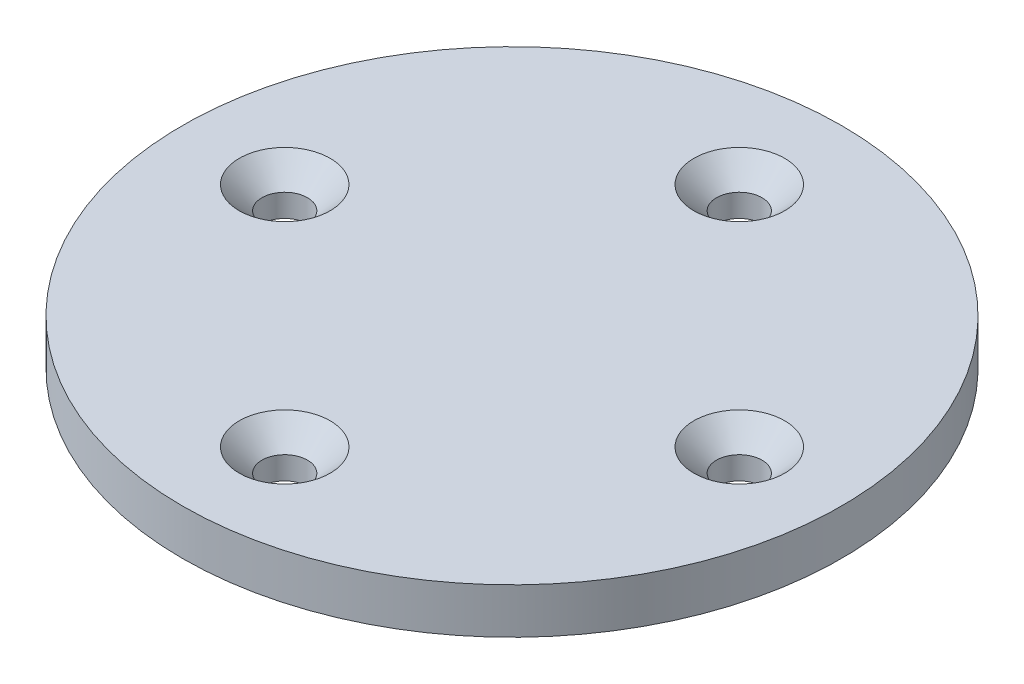
ISO-10303-21;
HEADER;
FILE_DESCRIPTION(('STEP AP214'),'2;1');
FILE_NAME('part.step','',(''),(''),'','','');
FILE_SCHEMA(('AUTOMOTIVE_DESIGN { 1 0 10303 214 1 1 1 1 }'));
ENDSEC;
DATA;
#1=APPLICATION_CONTEXT('core data for automotive mechanical design processes');
#2=APPLICATION_PROTOCOL_DEFINITION('international standard','automotive_design',2000,#1);
#3=PRODUCT_CONTEXT('',#1,'mechanical');
#4=PRODUCT('Part','Part','',(#3));
#5=PRODUCT_RELATED_PRODUCT_CATEGORY('part','',(#4));
#6=PRODUCT_DEFINITION_FORMATION('','',#4);
#7=PRODUCT_DEFINITION_CONTEXT('part definition',#1,'design');
#8=PRODUCT_DEFINITION('design','',#6,#7);
#9=PRODUCT_DEFINITION_SHAPE('','',#8);
#10=(LENGTH_UNIT() NAMED_UNIT(*) SI_UNIT(.MILLI.,.METRE.));
#11=(NAMED_UNIT(*) PLANE_ANGLE_UNIT() SI_UNIT($,.RADIAN.));
#12=(NAMED_UNIT(*) SI_UNIT($,.STERADIAN.) SOLID_ANGLE_UNIT());
#13=UNCERTAINTY_MEASURE_WITH_UNIT(LENGTH_MEASURE(1.E-05),#10,'distance_accuracy_value','');
#14=(GEOMETRIC_REPRESENTATION_CONTEXT(3) GLOBAL_UNCERTAINTY_ASSIGNED_CONTEXT((#13)) GLOBAL_UNIT_ASSIGNED_CONTEXT((#10,
#11,#12)) REPRESENTATION_CONTEXT('',''));
#15=CARTESIAN_POINT('',(0.,0.,0.));
#16=DIRECTION('',(0.,0.,1.));
#17=DIRECTION('',(1.,0.,0.));
#18=AXIS2_PLACEMENT_3D('',#15,#16,#17);
#19=CARTESIAN_POINT('',(0.,2.,0.));
#20=DIRECTION('',(0.,-1.,0.));
#21=DIRECTION('',(0.,0.,-1.));
#22=AXIS2_PLACEMENT_3D('',#19,#20,#21);
#23=CYLINDRICAL_SURFACE('',#22,14.5);
#24=CARTESIAN_POINT('',(0.,2.,0.));
#25=DIRECTION('',(0.,1.,0.));
#26=DIRECTION('',(0.,0.,1.));
#27=AXIS2_PLACEMENT_3D('',#24,#25,#26);
#28=CIRCLE('',#27,14.5);
#29=CARTESIAN_POINT('',(0.,2.,14.5));
#30=VERTEX_POINT('',#29);
#31=EDGE_CURVE('E86',#30,#30,#28,.T.);
#32=ORIENTED_EDGE('',*,*,#31,.F.);
#33=EDGE_LOOP('',(#32));
#34=FACE_BOUND('',#33,.T.);
#35=CARTESIAN_POINT('',(0.,0.,0.));
#36=DIRECTION('',(0.,1.,0.));
#37=DIRECTION('',(0.,0.,1.));
#38=AXIS2_PLACEMENT_3D('',#35,#36,#37);
#39=CIRCLE('',#38,14.5);
#40=CARTESIAN_POINT('',(0.,0.,14.5));
#41=VERTEX_POINT('',#40);
#42=EDGE_CURVE('E97',#41,#41,#39,.T.);
#43=ORIENTED_EDGE('',*,*,#42,.T.);
#44=EDGE_LOOP('',(#43));
#45=FACE_BOUND('',#44,.T.);
#46=ADVANCED_FACE('F45',(#34,#45),#23,.T.);
#47=CARTESIAN_POINT('',(0.,2.,0.));
#48=DIRECTION('',(0.,1.,0.));
#49=DIRECTION('',(0.,0.,1.));
#50=AXIS2_PLACEMENT_3D('',#47,#48,#49);
#51=PLANE('',#50);
#52=CARTESIAN_POINT('',(10.,2.,0.));
#53=DIRECTION('',(0.,1.,0.));
#54=DIRECTION('',(0.,0.,1.));
#55=AXIS2_PLACEMENT_3D('',#52,#53,#54);
#56=CIRCLE('',#55,2.00000000000001);
#57=CARTESIAN_POINT('',(10.,2.,2.00000000000004));
#58=VERTEX_POINT('',#57);
#59=EDGE_CURVE('E64',#58,#58,#56,.F.);
#60=ORIENTED_EDGE('',*,*,#59,.T.);
#61=EDGE_LOOP('',(#60));
#62=FACE_BOUND('',#61,.T.);
#63=CARTESIAN_POINT('',(0.,2.,10.));
#64=DIRECTION('',(0.,1.,0.));
#65=DIRECTION('',(0.,0.,1.));
#66=AXIS2_PLACEMENT_3D('',#63,#64,#65);
#67=CIRCLE('',#66,2.00000000000001);
#68=CARTESIAN_POINT('',(0.,2.,12.));
#69=VERTEX_POINT('',#68);
#70=EDGE_CURVE('E70',#69,#69,#67,.F.);
#71=ORIENTED_EDGE('',*,*,#70,.T.);
#72=EDGE_LOOP('',(#71));
#73=FACE_BOUND('',#72,.T.);
#74=CARTESIAN_POINT('',(0.,2.,-10.));
#75=DIRECTION('',(0.,1.,0.));
#76=DIRECTION('',(0.,0.,1.));
#77=AXIS2_PLACEMENT_3D('',#74,#75,#76);
#78=CIRCLE('',#77,2.);
#79=CARTESIAN_POINT('',(0.,2.,-8.));
#80=VERTEX_POINT('',#79);
#81=EDGE_CURVE('E74',#80,#80,#78,.F.);
#82=ORIENTED_EDGE('',*,*,#81,.T.);
#83=EDGE_LOOP('',(#82));
#84=FACE_BOUND('',#83,.T.);
#85=CARTESIAN_POINT('',(-10.,2.,-1.04744440165294E-13));
#86=DIRECTION('',(0.,1.,0.));
#87=DIRECTION('',(0.,0.,1.));
#88=AXIS2_PLACEMENT_3D('',#85,#86,#87);
#89=CIRCLE('',#88,2.00000000000001);
#90=CARTESIAN_POINT('',(-10.,2.,1.9999999999999));
#91=VERTEX_POINT('',#90);
#92=EDGE_CURVE('E78',#91,#91,#89,.F.);
#93=ORIENTED_EDGE('',*,*,#92,.T.);
#94=EDGE_LOOP('',(#93));
#95=FACE_BOUND('',#94,.T.);
#96=ORIENTED_EDGE('',*,*,#31,.T.);
#97=EDGE_LOOP('',(#96));
#98=FACE_BOUND('',#97,.T.);
#99=ADVANCED_FACE('F130',(#62,#73,#84,#95,#98),#51,.T.);
#100=CARTESIAN_POINT('',(0.,0.,0.));
#101=DIRECTION('',(0.,1.,0.));
#102=DIRECTION('',(0.,0.,1.));
#103=AXIS2_PLACEMENT_3D('',#100,#101,#102);
#104=PLANE('',#103);
#105=CARTESIAN_POINT('',(0.,0.,-10.));
#106=DIRECTION('',(0.,1.,0.));
#107=DIRECTION('',(0.,0.,1.));
#108=AXIS2_PLACEMENT_3D('',#105,#106,#107);
#109=CIRCLE('',#108,0.999999999999992);
#110=CARTESIAN_POINT('',(0.,0.,-9.00000000000001));
#111=VERTEX_POINT('',#110);
#112=EDGE_CURVE('E87',#111,#111,#109,.T.);
#113=ORIENTED_EDGE('',*,*,#112,.T.);
#114=EDGE_LOOP('',(#113));
#115=FACE_BOUND('',#114,.T.);
#116=CARTESIAN_POINT('',(10.,0.,0.));
#117=DIRECTION('',(0.,1.,0.));
#118=DIRECTION('',(0.,0.,1.));
#119=AXIS2_PLACEMENT_3D('',#116,#117,#118);
#120=CIRCLE('',#119,0.999999999999992);
#121=CARTESIAN_POINT('',(10.,0.,1.00000000000003));
#122=VERTEX_POINT('',#121);
#123=EDGE_CURVE('E91',#122,#122,#120,.T.);
#124=ORIENTED_EDGE('',*,*,#123,.T.);
#125=EDGE_LOOP('',(#124));
#126=FACE_BOUND('',#125,.T.);
#127=CARTESIAN_POINT('',(0.,0.,10.));
#128=DIRECTION('',(0.,1.,0.));
#129=DIRECTION('',(0.,0.,1.));
#130=AXIS2_PLACEMENT_3D('',#127,#128,#129);
#131=CIRCLE('',#130,0.999999999999992);
#132=CARTESIAN_POINT('',(0.,0.,11.));
#133=VERTEX_POINT('',#132);
#134=EDGE_CURVE('E92',#133,#133,#131,.T.);
#135=ORIENTED_EDGE('',*,*,#134,.T.);
#136=EDGE_LOOP('',(#135));
#137=FACE_BOUND('',#136,.T.);
#138=CARTESIAN_POINT('',(-10.,0.,-1.04744440165294E-13));
#139=DIRECTION('',(0.,1.,0.));
#140=DIRECTION('',(0.,0.,1.));
#141=AXIS2_PLACEMENT_3D('',#138,#139,#140);
#142=CIRCLE('',#141,0.999999999999992);
#143=CARTESIAN_POINT('',(-10.,0.,0.999999999999888));
#144=VERTEX_POINT('',#143);
#145=EDGE_CURVE('E96',#144,#144,#142,.T.);
#146=ORIENTED_EDGE('',*,*,#145,.T.);
#147=EDGE_LOOP('',(#146));
#148=FACE_BOUND('',#147,.T.);
#149=ORIENTED_EDGE('',*,*,#42,.F.);
#150=EDGE_LOOP('',(#149));
#151=FACE_BOUND('',#150,.T.);
#152=ADVANCED_FACE('F111',(#115,#126,#137,#148,#151),#104,.F.);
#153=CARTESIAN_POINT('',(-10.,2.,-1.04744440165294E-13));
#154=DIRECTION('',(0.,1.,0.));
#155=DIRECTION('',(0.,0.,1.));
#156=AXIS2_PLACEMENT_3D('',#153,#154,#155);
#157=CYLINDRICAL_SURFACE('',#156,0.999999999999992);
#158=CARTESIAN_POINT('',(-10.,0.999999999999987,-1.04744440165294E-13));
#159=DIRECTION('',(0.,1.,0.));
#160=DIRECTION('',(0.,0.,1.));
#161=AXIS2_PLACEMENT_3D('',#158,#159,#160);
#162=CIRCLE('',#161,0.999999999999992);
#163=CARTESIAN_POINT('',(-10.,0.999999999999987,0.999999999999888));
#164=VERTEX_POINT('',#163);
#165=EDGE_CURVE('E10',#164,#164,#162,.T.);
#166=ORIENTED_EDGE('',*,*,#165,.T.);
#167=EDGE_LOOP('',(#166));
#168=FACE_BOUND('',#167,.T.);
#169=ORIENTED_EDGE('',*,*,#145,.F.);
#170=EDGE_LOOP('',(#169));
#171=FACE_BOUND('',#170,.T.);
#172=ADVANCED_FACE('F126',(#168,#171),#157,.F.);
#173=CARTESIAN_POINT('',(0.,2.,10.));
#174=DIRECTION('',(0.,1.,0.));
#175=DIRECTION('',(0.,0.,1.));
#176=AXIS2_PLACEMENT_3D('',#173,#174,#175);
#177=CYLINDRICAL_SURFACE('',#176,0.999999999999992);
#178=CARTESIAN_POINT('',(0.,0.999999999999987,10.));
#179=DIRECTION('',(0.,1.,0.));
#180=DIRECTION('',(0.,0.,1.));
#181=AXIS2_PLACEMENT_3D('',#178,#179,#180);
#182=CIRCLE('',#181,0.999999999999992);
#183=CARTESIAN_POINT('',(0.,0.999999999999987,11.));
#184=VERTEX_POINT('',#183);
#185=EDGE_CURVE('E59',#184,#184,#182,.T.);
#186=ORIENTED_EDGE('',*,*,#185,.T.);
#187=EDGE_LOOP('',(#186));
#188=FACE_BOUND('',#187,.T.);
#189=ORIENTED_EDGE('',*,*,#134,.F.);
#190=EDGE_LOOP('',(#189));
#191=FACE_BOUND('',#190,.T.);
#192=ADVANCED_FACE('F117',(#188,#191),#177,.F.);
#193=CARTESIAN_POINT('',(10.,2.,0.));
#194=DIRECTION('',(0.,1.,0.));
#195=DIRECTION('',(0.,0.,1.));
#196=AXIS2_PLACEMENT_3D('',#193,#194,#195);
#197=CYLINDRICAL_SURFACE('',#196,0.999999999999992);
#198=CARTESIAN_POINT('',(10.,0.999999999999987,0.));
#199=DIRECTION('',(0.,1.,0.));
#200=DIRECTION('',(0.,0.,1.));
#201=AXIS2_PLACEMENT_3D('',#198,#199,#200);
#202=CIRCLE('',#201,0.999999999999992);
#203=CARTESIAN_POINT('',(10.,0.999999999999987,1.00000000000003));
#204=VERTEX_POINT('',#203);
#205=EDGE_CURVE('E82',#204,#204,#202,.T.);
#206=ORIENTED_EDGE('',*,*,#205,.T.);
#207=EDGE_LOOP('',(#206));
#208=FACE_BOUND('',#207,.T.);
#209=ORIENTED_EDGE('',*,*,#123,.F.);
#210=EDGE_LOOP('',(#209));
#211=FACE_BOUND('',#210,.T.);
#212=ADVANCED_FACE('F114',(#208,#211),#197,.F.);
#213=CARTESIAN_POINT('',(0.,2.,-10.));
#214=DIRECTION('',(0.,1.,0.));
#215=DIRECTION('',(0.,0.,1.));
#216=AXIS2_PLACEMENT_3D('',#213,#214,#215);
#217=CYLINDRICAL_SURFACE('',#216,0.999999999999992);
#218=CARTESIAN_POINT('',(0.,0.999999999999997,-10.));
#219=DIRECTION('',(0.,1.,0.));
#220=DIRECTION('',(0.,0.,1.));
#221=AXIS2_PLACEMENT_3D('',#218,#219,#220);
#222=CIRCLE('',#221,0.999999999999992);
#223=CARTESIAN_POINT('',(0.,0.999999999999997,-9.00000000000001));
#224=VERTEX_POINT('',#223);
#225=EDGE_CURVE('E54',#224,#224,#222,.T.);
#226=ORIENTED_EDGE('',*,*,#225,.T.);
#227=EDGE_LOOP('',(#226));
#228=FACE_BOUND('',#227,.T.);
#229=ORIENTED_EDGE('',*,*,#112,.F.);
#230=EDGE_LOOP('',(#229));
#231=FACE_BOUND('',#230,.T.);
#232=ADVANCED_FACE('F116',(#228,#231),#217,.F.);
#233=CARTESIAN_POINT('',(10.,0.999999999999987,0.));
#234=DIRECTION('',(0.,1.,0.));
#235=DIRECTION('',(0.,0.,1.));
#236=AXIS2_PLACEMENT_3D('',#233,#234,#235);
#237=CONICAL_SURFACE('',#236,0.999999999999992,0.78539816339745);
#238=ORIENTED_EDGE('',*,*,#59,.F.);
#239=EDGE_LOOP('',(#238));
#240=FACE_BOUND('',#239,.T.);
#241=ORIENTED_EDGE('',*,*,#205,.F.);
#242=EDGE_LOOP('',(#241));
#243=FACE_BOUND('',#242,.T.);
#244=ADVANCED_FACE('F124',(#240,#243),#237,.F.);
#245=CARTESIAN_POINT('',(0.,0.999999999999987,10.));
#246=DIRECTION('',(0.,1.,0.));
#247=DIRECTION('',(0.,0.,1.));
#248=AXIS2_PLACEMENT_3D('',#245,#246,#247);
#249=CONICAL_SURFACE('',#248,0.999999999999992,0.78539816339745);
#250=ORIENTED_EDGE('',*,*,#70,.F.);
#251=EDGE_LOOP('',(#250));
#252=FACE_BOUND('',#251,.T.);
#253=ORIENTED_EDGE('',*,*,#185,.F.);
#254=EDGE_LOOP('',(#253));
#255=FACE_BOUND('',#254,.T.);
#256=ADVANCED_FACE('F149',(#252,#255),#249,.F.);
#257=CARTESIAN_POINT('',(0.,0.999999999999997,-10.));
#258=DIRECTION('',(0.,1.,0.));
#259=DIRECTION('',(0.,0.,1.));
#260=AXIS2_PLACEMENT_3D('',#257,#258,#259);
#261=CONICAL_SURFACE('',#260,0.999999999999992,0.78539816339745);
#262=ORIENTED_EDGE('',*,*,#81,.F.);
#263=EDGE_LOOP('',(#262));
#264=FACE_BOUND('',#263,.T.);
#265=ORIENTED_EDGE('',*,*,#225,.F.);
#266=EDGE_LOOP('',(#265));
#267=FACE_BOUND('',#266,.T.);
#268=ADVANCED_FACE('F155',(#264,#267),#261,.F.);
#269=CARTESIAN_POINT('',(-10.,0.999999999999987,-1.04744440165294E-13));
#270=DIRECTION('',(0.,1.,0.));
#271=DIRECTION('',(0.,0.,1.));
#272=AXIS2_PLACEMENT_3D('',#269,#270,#271);
#273=CONICAL_SURFACE('',#272,0.999999999999992,0.78539816339745);
#274=ORIENTED_EDGE('',*,*,#92,.F.);
#275=EDGE_LOOP('',(#274));
#276=FACE_BOUND('',#275,.T.);
#277=ORIENTED_EDGE('',*,*,#165,.F.);
#278=EDGE_LOOP('',(#277));
#279=FACE_BOUND('',#278,.T.);
#280=ADVANCED_FACE('F48',(#276,#279),#273,.F.);
#281=CLOSED_SHELL('',(#46,#99,#152,#172,#192,#212,#232,#244,#256,#268,#280));
#282=MANIFOLD_SOLID_BREP('B2',#281);
#283=ADVANCED_BREP_SHAPE_REPRESENTATION('',(#18,#282),#14);
#284=SHAPE_DEFINITION_REPRESENTATION(#9,#283);
ENDSEC;
END-ISO-10303-21;
